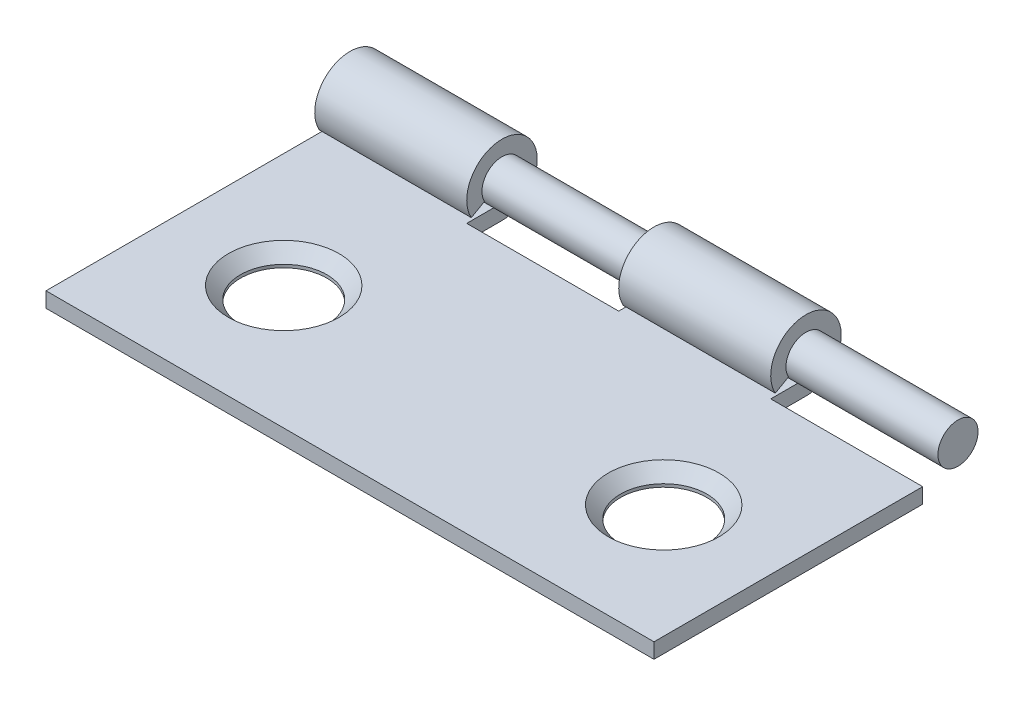
ISO-10303-21;
HEADER;
FILE_DESCRIPTION(('STEP AP214'),'2;1');
FILE_NAME('part.step','',(''),(''),'','','');
FILE_SCHEMA(('AUTOMOTIVE_DESIGN { 1 0 10303 214 1 1 1 1 }'));
ENDSEC;
DATA;
#1=APPLICATION_CONTEXT('core data for automotive mechanical design processes');
#2=APPLICATION_PROTOCOL_DEFINITION('international standard','automotive_design',2000,#1);
#3=PRODUCT_CONTEXT('',#1,'mechanical');
#4=PRODUCT('Part','Part','',(#3));
#5=PRODUCT_RELATED_PRODUCT_CATEGORY('part','',(#4));
#6=PRODUCT_DEFINITION_FORMATION('','',#4);
#7=PRODUCT_DEFINITION_CONTEXT('part definition',#1,'design');
#8=PRODUCT_DEFINITION('design','',#6,#7);
#9=PRODUCT_DEFINITION_SHAPE('','',#8);
#10=(LENGTH_UNIT() NAMED_UNIT(*) SI_UNIT(.MILLI.,.METRE.));
#11=(NAMED_UNIT(*) PLANE_ANGLE_UNIT() SI_UNIT($,.RADIAN.));
#12=(NAMED_UNIT(*) SI_UNIT($,.STERADIAN.) SOLID_ANGLE_UNIT());
#13=UNCERTAINTY_MEASURE_WITH_UNIT(LENGTH_MEASURE(1.E-05),#10,'distance_accuracy_value','');
#14=(GEOMETRIC_REPRESENTATION_CONTEXT(3) GLOBAL_UNCERTAINTY_ASSIGNED_CONTEXT((#13)) GLOBAL_UNIT_ASSIGNED_CONTEXT((#10,
#11,#12)) REPRESENTATION_CONTEXT('',''));
#15=CARTESIAN_POINT('',(0.,0.,0.));
#16=DIRECTION('',(0.,0.,1.));
#17=DIRECTION('',(1.,0.,0.));
#18=AXIS2_PLACEMENT_3D('',#15,#16,#17);
#19=CARTESIAN_POINT('',(12.6999999999999,0.,0.));
#20=DIRECTION('',(-1.,0.,0.));
#21=DIRECTION('',(0.,0.,1.));
#22=AXIS2_PLACEMENT_3D('',#19,#20,#21);
#23=CYLINDRICAL_SURFACE('',#22,0.8382);
#24=CARTESIAN_POINT('',(12.6999999999999,0.,0.));
#25=DIRECTION('',(1.,0.,0.));
#26=DIRECTION('',(0.,0.,-1.));
#27=AXIS2_PLACEMENT_3D('',#24,#25,#26);
#28=CIRCLE('',#27,0.8382);
#29=CARTESIAN_POINT('',(12.6999999999999,0.,0.838199999999958));
#30=VERTEX_POINT('',#29);
#31=EDGE_CURVE('E11',#30,#30,#28,.T.);
#32=CARTESIAN_POINT('',(-12.7000000000002,0.,0.));
#33=DIRECTION('',(1.,0.,0.));
#34=DIRECTION('',(0.,0.,-1.));
#35=AXIS2_PLACEMENT_3D('',#32,#33,#34);
#36=CIRCLE('',#35,0.8382);
#37=CARTESIAN_POINT('',(-12.7000000000002,0.,0.838199999999967));
#38=VERTEX_POINT('',#37);
#39=EDGE_CURVE('E53',#38,#38,#36,.T.);
#40=CARTESIAN_POINT('',(12.6999999999999,0.,0.838199999999958));
#41=CARTESIAN_POINT('',(12.4354166666666,0.,0.838199999999958));
#42=CARTESIAN_POINT('',(12.1708333333332,0.,0.838199999999958));
#43=CARTESIAN_POINT('',(11.6416666666666,0.,0.838199999999959));
#44=CARTESIAN_POINT('',(11.3770833333332,0.,0.838199999999959));
#45=CARTESIAN_POINT('',(10.8479166666666,0.,0.838199999999959));
#46=CARTESIAN_POINT('',(10.5833333333332,0.,0.838199999999959));
#47=CARTESIAN_POINT('',(10.0541666666666,0.,0.838199999999959));
#48=CARTESIAN_POINT('',(9.78958333333323,0.,0.838199999999959));
#49=CARTESIAN_POINT('',(9.26041666666657,0.,0.838199999999959));
#50=CARTESIAN_POINT('',(8.99583333333323,0.,0.83819999999996));
#51=CARTESIAN_POINT('',(8.46666666666657,0.,0.83819999999996));
#52=CARTESIAN_POINT('',(8.20208333333323,0.,0.83819999999996));
#53=CARTESIAN_POINT('',(7.67291666666656,0.,0.83819999999996));
#54=CARTESIAN_POINT('',(7.40833333333323,0.,0.83819999999996));
#55=CARTESIAN_POINT('',(6.87916666666656,0.,0.83819999999996));
#56=CARTESIAN_POINT('',(6.61458333333323,0.,0.83819999999996));
#57=CARTESIAN_POINT('',(6.08541666666656,0.,0.838199999999961));
#58=CARTESIAN_POINT('',(5.82083333333322,0.,0.838199999999961));
#59=CARTESIAN_POINT('',(5.29166666666656,0.,0.838199999999961));
#60=CARTESIAN_POINT('',(5.02708333333322,0.,0.838199999999961));
#61=CARTESIAN_POINT('',(4.49791666666655,0.,0.838199999999961));
#62=CARTESIAN_POINT('',(4.23333333333322,0.,0.838199999999961));
#63=CARTESIAN_POINT('',(3.70416666666655,0.,0.838199999999961));
#64=CARTESIAN_POINT('',(3.43958333333322,0.,0.838199999999961));
#65=CARTESIAN_POINT('',(2.91041666666655,0.,0.838199999999962));
#66=CARTESIAN_POINT('',(2.64583333333322,0.,0.838199999999962));
#67=CARTESIAN_POINT('',(2.11666666666655,0.,0.838199999999962));
#68=CARTESIAN_POINT('',(1.85208333333321,0.,0.838199999999962));
#69=CARTESIAN_POINT('',(1.32291666666655,0.,0.838199999999962));
#70=CARTESIAN_POINT('',(1.05833333333321,0.,0.838199999999962));
#71=CARTESIAN_POINT('',(0.529166666666545,0.,0.838199999999962));
#72=CARTESIAN_POINT('',(0.264583333333211,0.,0.838199999999962));
#73=CARTESIAN_POINT('',(-0.264583333333457,0.,0.838199999999963));
#74=CARTESIAN_POINT('',(-0.529166666666792,0.,0.838199999999963));
#75=CARTESIAN_POINT('',(-1.05833333333346,0.,0.838199999999963));
#76=CARTESIAN_POINT('',(-1.32291666666679,0.,0.838199999999963));
#77=CARTESIAN_POINT('',(-1.85208333333346,0.,0.838199999999963));
#78=CARTESIAN_POINT('',(-2.11666666666679,0.,0.838199999999963));
#79=CARTESIAN_POINT('',(-2.64583333333346,0.,0.838199999999963));
#80=CARTESIAN_POINT('',(-2.9104166666668,0.,0.838199999999963));
#81=CARTESIAN_POINT('',(-3.43958333333346,0.,0.838199999999964));
#82=CARTESIAN_POINT('',(-3.7041666666668,0.,0.838199999999964));
#83=CARTESIAN_POINT('',(-4.23333333333346,0.,0.838199999999964));
#84=CARTESIAN_POINT('',(-4.4979166666668,0.,0.838199999999964));
#85=CARTESIAN_POINT('',(-5.02708333333347,0.,0.838199999999964));
#86=CARTESIAN_POINT('',(-5.2916666666668,0.,0.838199999999964));
#87=CARTESIAN_POINT('',(-5.82083333333347,0.,0.838199999999964));
#88=CARTESIAN_POINT('',(-6.0854166666668,0.,0.838199999999964));
#89=CARTESIAN_POINT('',(-6.61458333333347,0.,0.838199999999965));
#90=CARTESIAN_POINT('',(-6.8791666666668,0.,0.838199999999965));
#91=CARTESIAN_POINT('',(-7.40833333333347,0.,0.838199999999965));
#92=CARTESIAN_POINT('',(-7.67291666666681,0.,0.838199999999965));
#93=CARTESIAN_POINT('',(-8.20208333333348,0.,0.838199999999965));
#94=CARTESIAN_POINT('',(-8.46666666666681,0.,0.838199999999965));
#95=CARTESIAN_POINT('',(-8.99583333333348,0.,0.838199999999965));
#96=CARTESIAN_POINT('',(-9.26041666666681,0.,0.838199999999965));
#97=CARTESIAN_POINT('',(-9.78958333333348,0.,0.838199999999966));
#98=CARTESIAN_POINT('',(-10.0541666666668,0.,0.838199999999966));
#99=CARTESIAN_POINT('',(-10.5833333333335,0.,0.838199999999966));
#100=CARTESIAN_POINT('',(-10.8479166666668,0.,0.838199999999966));
#101=CARTESIAN_POINT('',(-11.3770833333335,0.,0.838199999999966));
#102=CARTESIAN_POINT('',(-11.6416666666668,0.,0.838199999999966));
#103=CARTESIAN_POINT('',(-12.1708333333335,0.,0.838199999999966));
#104=CARTESIAN_POINT('',(-12.4354166666668,0.,0.838199999999966));
#105=CARTESIAN_POINT('',(-12.7000000000002,0.,0.838199999999967));
#106=B_SPLINE_CURVE_WITH_KNOTS('',3,(#40,#41,#42,#43,#44,#45,#46,#47,#48,#49,#50,#51,#52,#53,
#54,#55,#56,#57,#58,#59,#60,#61,#62,#63,#64,#65,#66,#67,#68,#69,#70,#71,#72,#73,#74,#75,#76,#77,
#78,#79,#80,#81,#82,#83,#84,#85,#86,#87,#88,#89,#90,#91,#92,#93,#94,#95,#96,#97,#98,#99,#100,
#101,#102,#103,#104,#105),.UNSPECIFIED.,.F.,.F.,(4,2,2,2,2,2,2,2,2,2,2,2,2,2,2,2,2,2,2,2,2,2,2,
2,2,2,2,2,2,2,2,2,4),(0.,0.793750000000001,1.5875,2.38125,3.17500000000001,3.96875000000001,
4.76250000000001,5.55625000000001,6.35000000000001,7.14375000000002,7.93750000000002,
8.73125000000002,9.52500000000002,10.31875,11.1125,11.90625,12.7,13.49375,14.2875,15.08125,
15.875,16.66875,17.4625,18.25625,19.05,19.84375,20.6375,21.43125,22.2250000000001,
23.0187500000001,23.8125000000001,24.6062500000001,25.4000000000001),.UNSPECIFIED.);
#107=EDGE_CURVE('BSEAM50',#30,#38,#106,.T.);
#108=ORIENTED_EDGE('',*,*,#31,.F.);
#109=ORIENTED_EDGE('',*,*,#39,.T.);
#110=ORIENTED_EDGE('',*,*,#107,.T.);
#111=ORIENTED_EDGE('',*,*,#107,.F.);
#112=EDGE_LOOP('',(#108,#110,#109,#111));
#113=FACE_BOUND('',#112,.T.);
#114=ADVANCED_FACE('F50',(#113),#23,.T.);
#115=CARTESIAN_POINT('',(12.6999999999999,0.,0.));
#116=DIRECTION('',(1.,0.,0.));
#117=DIRECTION('',(0.,0.,-1.));
#118=AXIS2_PLACEMENT_3D('',#115,#116,#117);
#119=PLANE('',#118);
#120=ORIENTED_EDGE('',*,*,#31,.T.);
#121=EDGE_LOOP('',(#120));
#122=FACE_BOUND('',#121,.T.);
#123=ADVANCED_FACE('F65',(#122),#119,.T.);
#124=CARTESIAN_POINT('',(-12.7000000000002,0.,0.));
#125=DIRECTION('',(1.,0.,0.));
#126=DIRECTION('',(0.,0.,-1.));
#127=AXIS2_PLACEMENT_3D('',#124,#125,#126);
#128=PLANE('',#127);
#129=ORIENTED_EDGE('',*,*,#39,.F.);
#130=EDGE_LOOP('',(#129));
#131=FACE_BOUND('',#130,.T.);
#132=ADVANCED_FACE('F63',(#131),#128,.F.);
#133=CLOSED_SHELL('',(#114,#123,#132));
#134=MANIFOLD_SOLID_BREP('B2',#133);
#135=CARTESIAN_POINT('',(12.6999999999999,1.38777878078145E-13,0.));
#136=DIRECTION('',(-1.,0.,0.));
#137=DIRECTION('',(0.,0.,1.));
#138=AXIS2_PLACEMENT_3D('',#135,#136,#137);
#139=CYLINDRICAL_SURFACE('',#138,1.47320000000008);
#140=CARTESIAN_POINT('',(6.3499999999999,2.22044604925031E-13,0.));
#141=DIRECTION('',(-1.,0.,0.));
#142=DIRECTION('',(0.,0.,1.));
#143=AXIS2_PLACEMENT_3D('',#140,#141,#142);
#144=CIRCLE('',#143,1.47320000000008);
#145=CARTESIAN_POINT('',(6.34999999999991,-0.728533124002562,1.28045215733776));
#146=VERTEX_POINT('',#145);
#147=CARTESIAN_POINT('',(6.34999999999987,-1.47320000000001,0.));
#148=VERTEX_POINT('',#147);
#149=EDGE_CURVE('E241',#146,#148,#144,.T.);
#150=ORIENTED_EDGE('',*,*,#149,.T.);
#151=DIRECTION('',(-1.,0.,0.));
#152=VECTOR('',#151,1.);
#153=CARTESIAN_POINT('',(12.6999999999999,-1.47320000000001,0.));
#154=LINE('',#153,#152);
#155=CARTESIAN_POINT('',(0.,-1.47319999999998,0.));
#156=VERTEX_POINT('',#155);
#157=EDGE_CURVE('E224',#148,#156,#154,.T.);
#158=ORIENTED_EDGE('',*,*,#157,.T.);
#159=CARTESIAN_POINT('',(0.,0.,0.));
#160=DIRECTION('',(1.,0.,0.));
#161=DIRECTION('',(0.,0.,-1.));
#162=AXIS2_PLACEMENT_3D('',#159,#160,#161);
#163=CIRCLE('',#162,1.47320000000008);
#164=CARTESIAN_POINT('',(-1.38777878078145E-13,-0.728533124002534,1.2804521573378));
#165=VERTEX_POINT('',#164);
#166=EDGE_CURVE('E265',#156,#165,#163,.T.);
#167=ORIENTED_EDGE('',*,*,#166,.T.);
#168=DIRECTION('',(-1.,0.,0.));
#169=VECTOR('',#168,1.);
#170=CARTESIAN_POINT('',(12.6999999999999,-0.728533124002562,1.28045215733778));
#171=LINE('',#170,#169);
#172=EDGE_CURVE('E302',#146,#165,#171,.T.);
#173=ORIENTED_EDGE('',*,*,#172,.F.);
#174=EDGE_LOOP('',(#150,#158,#167,#173));
#175=FACE_BOUND('',#174,.T.);
#176=ADVANCED_FACE('F102',(#175),#139,.T.);
#177=CARTESIAN_POINT('',(12.6999999999999,0.,0.));
#178=DIRECTION('',(-1.,0.,0.));
#179=DIRECTION('',(0.,0.,1.));
#180=AXIS2_PLACEMENT_3D('',#177,#178,#179);
#181=CYLINDRICAL_SURFACE('',#180,0.8382);
#182=DIRECTION('',(-1.,0.,0.));
#183=VECTOR('',#182,1.);
#184=CARTESIAN_POINT('',(12.6999999999999,-0.838199999999956,0.));
#185=LINE('',#184,#183);
#186=CARTESIAN_POINT('',(6.34999999999988,-0.838200000000039,0.));
#187=VERTEX_POINT('',#186);
#188=CARTESIAN_POINT('',(-1.11022302462516E-13,-0.838199999999872,0.));
#189=VERTEX_POINT('',#188);
#190=EDGE_CURVE('E313',#187,#189,#185,.T.);
#191=ORIENTED_EDGE('',*,*,#190,.F.);
#192=CARTESIAN_POINT('',(6.3499999999999,1.38777878078145E-13,0.));
#193=DIRECTION('',(-1.,0.,0.));
#194=DIRECTION('',(0.,0.,1.));
#195=AXIS2_PLACEMENT_3D('',#192,#193,#194);
#196=CIRCLE('',#195,0.8382);
#197=CARTESIAN_POINT('',(6.34999999999987,-0.414510225725695,0.728533124002506));
#198=VERTEX_POINT('',#197);
#199=EDGE_CURVE('E235',#187,#198,#196,.F.);
#200=ORIENTED_EDGE('',*,*,#199,.T.);
#201=DIRECTION('',(-1.,0.,0.));
#202=VECTOR('',#201,1.);
#203=CARTESIAN_POINT('',(12.6999999999999,-0.414510225725556,0.72853312400252));
#204=LINE('',#203,#202);
#205=CARTESIAN_POINT('',(-1.38777878078145E-13,-0.414510225725528,0.728533124002527));
#206=VERTEX_POINT('',#205);
#207=EDGE_CURVE('E299',#198,#206,#204,.T.);
#208=ORIENTED_EDGE('',*,*,#207,.T.);
#209=CARTESIAN_POINT('',(0.,0.,0.));
#210=DIRECTION('',(1.,0.,0.));
#211=DIRECTION('',(0.,0.,-1.));
#212=AXIS2_PLACEMENT_3D('',#209,#210,#211);
#213=CIRCLE('',#212,0.8382);
#214=EDGE_CURVE('E264',#206,#189,#213,.F.);
#215=ORIENTED_EDGE('',*,*,#214,.T.);
#216=EDGE_LOOP('',(#191,#200,#208,#215));
#217=FACE_BOUND('',#216,.T.);
#218=ADVANCED_FACE('F388',(#217),#181,.F.);
#219=CARTESIAN_POINT('',(12.6999999999999,-0.414510225725556,0.72853312400252));
#220=DIRECTION('',(0.,0.869163832024046,0.494524249255059));
#221=DIRECTION('',(0.,-0.494524249255061,0.869163832024044));
#222=AXIS2_PLACEMENT_3D('',#219,#220,#221);
#223=PLANE('',#222);
#224=ORIENTED_EDGE('',*,*,#207,.F.);
#225=DIRECTION('',(0.,-0.494524249255061,0.869163832024044));
#226=VECTOR('',#225,1.);
#227=CARTESIAN_POINT('',(6.34999999999987,-0.414510225725695,0.728533124002506));
#228=LINE('',#227,#226);
#229=EDGE_CURVE('E238',#198,#146,#228,.T.);
#230=ORIENTED_EDGE('',*,*,#229,.T.);
#231=ORIENTED_EDGE('',*,*,#172,.T.);
#232=DIRECTION('',(0.,0.494524249255061,-0.869163832024044));
#233=VECTOR('',#232,1.);
#234=CARTESIAN_POINT('',(-1.38777878078145E-13,-0.414510225725528,0.728533124002527));
#235=LINE('',#234,#233);
#236=EDGE_CURVE('E48',#165,#206,#235,.T.);
#237=ORIENTED_EDGE('',*,*,#236,.T.);
#238=EDGE_LOOP('',(#224,#230,#231,#237));
#239=FACE_BOUND('',#238,.T.);
#240=ADVANCED_FACE('F385',(#239),#223,.F.);
#241=CARTESIAN_POINT('',(-6.35000000000011,-0.838200000000011,0.));
#242=VERTEX_POINT('',#241);
#243=CARTESIAN_POINT('',(-12.7,-0.838200000000011,0.));
#244=VERTEX_POINT('',#243);
#245=EDGE_CURVE('E312',#242,#244,#185,.T.);
#246=ORIENTED_EDGE('',*,*,#245,.F.);
#247=CARTESIAN_POINT('',(-6.35000000000013,1.11022302462516E-13,0.));
#248=DIRECTION('',(-1.,0.,0.));
#249=DIRECTION('',(0.,0.,1.));
#250=AXIS2_PLACEMENT_3D('',#247,#248,#249);
#251=CIRCLE('',#250,0.8382);
#252=CARTESIAN_POINT('',(-6.35000000000016,-0.414510225725473,0.728533124002485));
#253=VERTEX_POINT('',#252);
#254=EDGE_CURVE('E255',#242,#253,#251,.F.);
#255=ORIENTED_EDGE('',*,*,#254,.T.);
#256=CARTESIAN_POINT('',(-12.7000000000001,-0.414510225725528,0.728533124002534));
#257=VERTEX_POINT('',#256);
#258=EDGE_CURVE('E284',#253,#257,#204,.T.);
#259=ORIENTED_EDGE('',*,*,#258,.T.);
#260=CARTESIAN_POINT('',(-12.7000000000002,0.,0.));
#261=DIRECTION('',(-1.,0.,0.));
#262=DIRECTION('',(0.,0.,1.));
#263=AXIS2_PLACEMENT_3D('',#260,#261,#262);
#264=CIRCLE('',#263,0.8382);
#265=EDGE_CURVE('E276',#257,#244,#264,.T.);
#266=ORIENTED_EDGE('',*,*,#265,.T.);
#267=EDGE_LOOP('',(#246,#255,#259,#266));
#268=FACE_BOUND('',#267,.T.);
#269=ADVANCED_FACE('F104',(#268),#181,.F.);
#270=CARTESIAN_POINT('',(12.6999999999999,-0.838199999999983,12.7));
#271=DIRECTION('',(0.,-1.,0.));
#272=DIRECTION('',(0.,0.,-1.));
#273=AXIS2_PLACEMENT_3D('',#270,#271,#272);
#274=PLANE('',#273);
#275=CARTESIAN_POINT('',(7.95019999999984,-0.838200000000011,7.54379999999995));
#276=DIRECTION('',(0.,1.,0.));
#277=DIRECTION('',(0.,0.,1.));
#278=AXIS2_PLACEMENT_3D('',#275,#276,#277);
#279=CIRCLE('',#278,2.3114);
#280=CARTESIAN_POINT('',(7.95019999999984,-0.838200000000011,9.85519999999996));
#281=VERTEX_POINT('',#280);
#282=EDGE_CURVE('E225',#281,#281,#279,.T.);
#283=ORIENTED_EDGE('',*,*,#282,.F.);
#284=EDGE_LOOP('',(#283));
#285=FACE_BOUND('',#284,.T.);
#286=CARTESIAN_POINT('',(-7.92480000000015,-0.838200000000039,7.54379999999998));
#287=DIRECTION('',(0.,1.,0.));
#288=DIRECTION('',(0.,0.,1.));
#289=AXIS2_PLACEMENT_3D('',#286,#287,#288);
#290=CIRCLE('',#289,2.3114);
#291=CARTESIAN_POINT('',(-7.92480000000015,-0.838200000000039,9.85519999999998));
#292=VERTEX_POINT('',#291);
#293=EDGE_CURVE('E228',#292,#292,#290,.T.);
#294=ORIENTED_EDGE('',*,*,#293,.F.);
#295=EDGE_LOOP('',(#294));
#296=FACE_BOUND('',#295,.T.);
#297=DIRECTION('',(0.,0.,1.));
#298=VECTOR('',#297,1.);
#299=CARTESIAN_POINT('',(12.6999999999999,-0.838199999999983,12.7));
#300=LINE('',#299,#298);
#301=CARTESIAN_POINT('',(12.6999999999999,-0.838200000000011,1.47320000000012));
#302=VERTEX_POINT('',#301);
#303=CARTESIAN_POINT('',(12.6999999999999,-0.838199999999983,12.7));
#304=VERTEX_POINT('',#303);
#305=EDGE_CURVE('E277',#302,#304,#300,.T.);
#306=ORIENTED_EDGE('',*,*,#305,.F.);
#307=DIRECTION('',(-1.,0.,0.));
#308=VECTOR('',#307,1.);
#309=CARTESIAN_POINT('',(12.6999999999999,-0.838200000000011,1.47320000000012));
#310=LINE('',#309,#308);
#311=CARTESIAN_POINT('',(6.34999999999988,-0.8381999999999,1.47320000000006));
#312=VERTEX_POINT('',#311);
#313=EDGE_CURVE('E119',#302,#312,#310,.T.);
#314=ORIENTED_EDGE('',*,*,#313,.T.);
#315=DIRECTION('',(0.,0.,-1.));
#316=VECTOR('',#315,1.);
#317=CARTESIAN_POINT('',(6.34999999999988,-0.838199999999983,12.7));
#318=LINE('',#317,#316);
#319=EDGE_CURVE('E212',#312,#187,#318,.T.);
#320=ORIENTED_EDGE('',*,*,#319,.T.);
#321=ORIENTED_EDGE('',*,*,#190,.T.);
#322=DIRECTION('',(0.,0.,1.));
#323=VECTOR('',#322,1.);
#324=CARTESIAN_POINT('',(-1.38777878078145E-13,-0.838199999999983,12.6999999999999));
#325=LINE('',#324,#323);
#326=CARTESIAN_POINT('',(-1.38777878078145E-13,-0.838200000000011,1.47320000000007));
#327=VERTEX_POINT('',#326);
#328=EDGE_CURVE('E268',#189,#327,#325,.T.);
#329=ORIENTED_EDGE('',*,*,#328,.T.);
#330=DIRECTION('',(-1.,0.,0.));
#331=VECTOR('',#330,1.);
#332=CARTESIAN_POINT('',(12.6999999999999,-0.838200000000011,1.47320000000012));
#333=LINE('',#332,#331);
#334=CARTESIAN_POINT('',(-6.35000000000013,-0.838199999999983,1.47320000000008));
#335=VERTEX_POINT('',#334);
#336=EDGE_CURVE('E273',#327,#335,#333,.T.);
#337=ORIENTED_EDGE('',*,*,#336,.T.);
#338=DIRECTION('',(0.,0.,-1.));
#339=VECTOR('',#338,1.);
#340=CARTESIAN_POINT('',(-6.35000000000013,-0.838199999999983,12.7));
#341=LINE('',#340,#339);
#342=EDGE_CURVE('E259',#335,#242,#341,.T.);
#343=ORIENTED_EDGE('',*,*,#342,.T.);
#344=ORIENTED_EDGE('',*,*,#245,.T.);
#345=DIRECTION('',(0.,0.,1.));
#346=VECTOR('',#345,1.);
#347=CARTESIAN_POINT('',(-12.7000000000001,-0.838199999999956,12.7));
#348=LINE('',#347,#346);
#349=CARTESIAN_POINT('',(-12.7000000000001,-0.838199999999956,12.7));
#350=VERTEX_POINT('',#349);
#351=EDGE_CURVE('E287',#244,#350,#348,.T.);
#352=ORIENTED_EDGE('',*,*,#351,.T.);
#353=DIRECTION('',(-1.,0.,0.));
#354=VECTOR('',#353,1.);
#355=CARTESIAN_POINT('',(12.6999999999999,-0.838199999999983,12.7));
#356=LINE('',#355,#354);
#357=EDGE_CURVE('E309',#304,#350,#356,.T.);
#358=ORIENTED_EDGE('',*,*,#357,.F.);
#359=EDGE_LOOP('',(#306,#314,#320,#321,#329,#337,#343,#344,#352,#358));
#360=FACE_BOUND('',#359,.T.);
#361=ADVANCED_FACE('F346',(#285,#296,#360),#274,.F.);
#362=CARTESIAN_POINT('',(12.6999999999999,-1.4731999999999,12.6999999999999));
#363=DIRECTION('',(0.,0.,-1.));
#364=DIRECTION('',(-1.,0.,0.));
#365=AXIS2_PLACEMENT_3D('',#362,#363,#364);
#366=PLANE('',#365);
#367=DIRECTION('',(0.,-1.,0.));
#368=VECTOR('',#367,1.);
#369=CARTESIAN_POINT('',(-12.7000000000002,-1.47320000000001,12.6999999999999));
#370=LINE('',#369,#368);
#371=CARTESIAN_POINT('',(-12.7000000000002,-1.47320000000001,12.6999999999999));
#372=VERTEX_POINT('',#371);
#373=EDGE_CURVE('E289',#350,#372,#370,.T.);
#374=ORIENTED_EDGE('',*,*,#373,.T.);
#375=DIRECTION('',(-1.,0.,0.));
#376=VECTOR('',#375,1.);
#377=CARTESIAN_POINT('',(12.6999999999999,-1.4731999999999,12.6999999999999));
#378=LINE('',#377,#376);
#379=CARTESIAN_POINT('',(12.6999999999999,-1.4731999999999,12.6999999999999));
#380=VERTEX_POINT('',#379);
#381=EDGE_CURVE('E306',#380,#372,#378,.T.);
#382=ORIENTED_EDGE('',*,*,#381,.F.);
#383=DIRECTION('',(0.,-1.,0.));
#384=VECTOR('',#383,1.);
#385=CARTESIAN_POINT('',(12.6999999999999,-1.4731999999999,12.6999999999999));
#386=LINE('',#385,#384);
#387=EDGE_CURVE('E279',#304,#380,#386,.T.);
#388=ORIENTED_EDGE('',*,*,#387,.F.);
#389=ORIENTED_EDGE('',*,*,#357,.T.);
#390=EDGE_LOOP('',(#374,#382,#388,#389));
#391=FACE_BOUND('',#390,.T.);
#392=ADVANCED_FACE('F349',(#391),#366,.F.);
#393=CARTESIAN_POINT('',(12.6999999999999,-1.47320000000001,0.));
#394=DIRECTION('',(0.,1.,0.));
#395=DIRECTION('',(0.,0.,1.));
#396=AXIS2_PLACEMENT_3D('',#393,#394,#395);
#397=PLANE('',#396);
#398=CARTESIAN_POINT('',(7.95019999999992,-1.47319999999998,7.54379999999995));
#399=DIRECTION('',(0.,1.,0.));
#400=DIRECTION('',(0.,0.,1.));
#401=AXIS2_PLACEMENT_3D('',#398,#399,#400);
#402=CIRCLE('',#401,1.8034);
#403=CARTESIAN_POINT('',(7.95019999999992,-1.47319999999998,9.34719999999995));
#404=VERTEX_POINT('',#403);
#405=EDGE_CURVE('E317',#404,#404,#402,.T.);
#406=ORIENTED_EDGE('',*,*,#405,.T.);
#407=EDGE_LOOP('',(#406));
#408=FACE_BOUND('',#407,.T.);
#409=CARTESIAN_POINT('',(-7.92480000000012,-1.47320000000001,7.54379999999996));
#410=DIRECTION('',(0.,1.,0.));
#411=DIRECTION('',(0.,0.,1.));
#412=AXIS2_PLACEMENT_3D('',#409,#410,#411);
#413=CIRCLE('',#412,1.8034);
#414=CARTESIAN_POINT('',(-7.92480000000012,-1.47320000000001,9.34719999999996));
#415=VERTEX_POINT('',#414);
#416=EDGE_CURVE('E322',#415,#415,#413,.T.);
#417=ORIENTED_EDGE('',*,*,#416,.T.);
#418=EDGE_LOOP('',(#417));
#419=FACE_BOUND('',#418,.T.);
#420=DIRECTION('',(0.,0.,1.));
#421=VECTOR('',#420,1.);
#422=CARTESIAN_POINT('',(6.34999999999987,-1.47320000000001,1.4732000000001));
#423=LINE('',#422,#421);
#424=CARTESIAN_POINT('',(6.34999999999987,-1.47320000000001,1.4732000000001));
#425=VERTEX_POINT('',#424);
#426=EDGE_CURVE('E209',#148,#425,#423,.T.);
#427=ORIENTED_EDGE('',*,*,#426,.T.);
#428=DIRECTION('',(1.,0.,0.));
#429=VECTOR('',#428,1.);
#430=CARTESIAN_POINT('',(12.6999999999999,-1.47319999999998,1.47320000000009));
#431=LINE('',#430,#429);
#432=CARTESIAN_POINT('',(12.6999999999999,-1.47319999999998,1.47320000000009));
#433=VERTEX_POINT('',#432);
#434=EDGE_CURVE('E214',#425,#433,#431,.T.);
#435=ORIENTED_EDGE('',*,*,#434,.T.);
#436=DIRECTION('',(0.,0.,-1.));
#437=VECTOR('',#436,1.);
#438=CARTESIAN_POINT('',(12.6999999999999,-1.47320000000001,0.));
#439=LINE('',#438,#437);
#440=EDGE_CURVE('E282',#380,#433,#439,.T.);
#441=ORIENTED_EDGE('',*,*,#440,.F.);
#442=ORIENTED_EDGE('',*,*,#381,.T.);
#443=DIRECTION('',(0.,0.,-1.));
#444=VECTOR('',#443,1.);
#445=CARTESIAN_POINT('',(-12.7000000000001,-1.47319999999998,0.));
#446=LINE('',#445,#444);
#447=CARTESIAN_POINT('',(-12.7000000000001,-1.47319999999998,0.));
#448=VERTEX_POINT('',#447);
#449=EDGE_CURVE('E291',#372,#448,#446,.T.);
#450=ORIENTED_EDGE('',*,*,#449,.T.);
#451=CARTESIAN_POINT('',(-6.35000000000013,-1.47319999999998,-1.11022302462516E-13));
#452=VERTEX_POINT('',#451);
#453=EDGE_CURVE('E304',#452,#448,#154,.T.);
#454=ORIENTED_EDGE('',*,*,#453,.F.);
#455=DIRECTION('',(0.,0.,1.));
#456=VECTOR('',#455,1.);
#457=CARTESIAN_POINT('',(-6.35000000000013,-1.47320000000009,1.4732000000001));
#458=LINE('',#457,#456);
#459=CARTESIAN_POINT('',(-6.35000000000013,-1.47320000000009,1.4732000000001));
#460=VERTEX_POINT('',#459);
#461=EDGE_CURVE('E245',#452,#460,#458,.T.);
#462=ORIENTED_EDGE('',*,*,#461,.T.);
#463=DIRECTION('',(1.,0.,0.));
#464=VECTOR('',#463,1.);
#465=CARTESIAN_POINT('',(-1.66533453693773E-13,-1.47319999999998,1.4732000000001));
#466=LINE('',#465,#464);
#467=CARTESIAN_POINT('',(-1.66533453693773E-13,-1.47319999999998,1.4732000000001));
#468=VERTEX_POINT('',#467);
#469=EDGE_CURVE('E248',#460,#468,#466,.T.);
#470=ORIENTED_EDGE('',*,*,#469,.T.);
#471=DIRECTION('',(0.,0.,-1.));
#472=VECTOR('',#471,1.);
#473=CARTESIAN_POINT('',(-1.38777878078145E-13,-1.47320000000001,-1.47320000000017));
#474=LINE('',#473,#472);
#475=EDGE_CURVE('E243',#468,#156,#474,.T.);
#476=ORIENTED_EDGE('',*,*,#475,.T.);
#477=ORIENTED_EDGE('',*,*,#157,.F.);
#478=EDGE_LOOP('',(#427,#435,#441,#442,#450,#454,#462,#470,#476,#477));
#479=FACE_BOUND('',#478,.T.);
#480=ADVANCED_FACE('F222',(#408,#419,#479),#397,.F.);
#481=CARTESIAN_POINT('',(-6.35000000000011,-0.728533124002534,1.28045215733778));
#482=VERTEX_POINT('',#481);
#483=CARTESIAN_POINT('',(-12.7000000000001,-0.728533124002534,1.28045215733778));
#484=VERTEX_POINT('',#483);
#485=EDGE_CURVE('E301',#482,#484,#171,.T.);
#486=ORIENTED_EDGE('',*,*,#485,.F.);
#487=CARTESIAN_POINT('',(-6.35000000000013,1.66533453693773E-13,-1.04083408558608E-13));
#488=DIRECTION('',(-1.,0.,0.));
#489=DIRECTION('',(0.,0.,1.));
#490=AXIS2_PLACEMENT_3D('',#487,#488,#489);
#491=CIRCLE('',#490,1.47320000000008);
#492=EDGE_CURVE('E127',#482,#452,#491,.T.);
#493=ORIENTED_EDGE('',*,*,#492,.T.);
#494=ORIENTED_EDGE('',*,*,#453,.T.);
#495=CARTESIAN_POINT('',(-12.7000000000001,0.,-1.04083408558608E-13));
#496=DIRECTION('',(1.,0.,0.));
#497=DIRECTION('',(0.,0.,1.));
#498=AXIS2_PLACEMENT_3D('',#495,#496,#497);
#499=CIRCLE('',#498,1.47320000000008);
#500=EDGE_CURVE('E294',#448,#484,#499,.T.);
#501=ORIENTED_EDGE('',*,*,#500,.T.);
#502=EDGE_LOOP('',(#486,#493,#494,#501));
#503=FACE_BOUND('',#502,.T.);
#504=ADVANCED_FACE('F369',(#503),#139,.T.);
#505=ORIENTED_EDGE('',*,*,#258,.F.);
#506=DIRECTION('',(0.,-0.494524249255061,0.869163832024044));
#507=VECTOR('',#506,1.);
#508=CARTESIAN_POINT('',(-6.35000000000016,-0.414510225725501,0.728533124002485));
#509=LINE('',#508,#507);
#510=EDGE_CURVE('E111',#253,#482,#509,.T.);
#511=ORIENTED_EDGE('',*,*,#510,.T.);
#512=ORIENTED_EDGE('',*,*,#485,.T.);
#513=DIRECTION('',(0.,0.494524249255061,-0.869163832024044));
#514=VECTOR('',#513,1.);
#515=CARTESIAN_POINT('',(-12.7000000000001,-0.414510225725528,0.728533124002534));
#516=LINE('',#515,#514);
#517=EDGE_CURVE('E280',#484,#257,#516,.T.);
#518=ORIENTED_EDGE('',*,*,#517,.T.);
#519=EDGE_LOOP('',(#505,#511,#512,#518));
#520=FACE_BOUND('',#519,.T.);
#521=ADVANCED_FACE('F405',(#520),#223,.F.);
#522=CARTESIAN_POINT('',(12.6999999999999,0.,0.));
#523=DIRECTION('',(-1.,0.,0.));
#524=DIRECTION('',(0.,0.,1.));
#525=AXIS2_PLACEMENT_3D('',#522,#523,#524);
#526=PLANE('',#525);
#527=ORIENTED_EDGE('',*,*,#440,.T.);
#528=DIRECTION('',(0.,1.,0.));
#529=VECTOR('',#528,1.);
#530=CARTESIAN_POINT('',(12.6999999999999,-1.47319999999998,1.47320000000009));
#531=LINE('',#530,#529);
#532=EDGE_CURVE('E213',#433,#302,#531,.T.);
#533=ORIENTED_EDGE('',*,*,#532,.T.);
#534=ORIENTED_EDGE('',*,*,#305,.T.);
#535=ORIENTED_EDGE('',*,*,#387,.T.);
#536=EDGE_LOOP('',(#527,#533,#534,#535));
#537=FACE_BOUND('',#536,.T.);
#538=ADVANCED_FACE('F355',(#537),#526,.F.);
#539=CARTESIAN_POINT('',(-12.7000000000002,0.,0.));
#540=DIRECTION('',(-1.,0.,0.));
#541=DIRECTION('',(0.,0.,1.));
#542=AXIS2_PLACEMENT_3D('',#539,#540,#541);
#543=PLANE('',#542);
#544=ORIENTED_EDGE('',*,*,#265,.F.);
#545=ORIENTED_EDGE('',*,*,#517,.F.);
#546=ORIENTED_EDGE('',*,*,#500,.F.);
#547=ORIENTED_EDGE('',*,*,#449,.F.);
#548=ORIENTED_EDGE('',*,*,#373,.F.);
#549=ORIENTED_EDGE('',*,*,#351,.F.);
#550=EDGE_LOOP('',(#544,#545,#546,#547,#548,#549));
#551=FACE_BOUND('',#550,.T.);
#552=ADVANCED_FACE('F364',(#551),#543,.T.);
#553=CARTESIAN_POINT('',(-1.66533453693773E-13,-1.47319999999998,1.4732000000001));
#554=DIRECTION('',(0.,0.,1.));
#555=DIRECTION('',(1.,0.,0.));
#556=AXIS2_PLACEMENT_3D('',#553,#554,#555);
#557=PLANE('',#556);
#558=DIRECTION('',(0.,1.,0.));
#559=VECTOR('',#558,1.);
#560=CARTESIAN_POINT('',(-1.66533453693773E-13,-1.47319999999998,1.4732000000001));
#561=LINE('',#560,#559);
#562=EDGE_CURVE('E252',#468,#327,#561,.T.);
#563=ORIENTED_EDGE('',*,*,#562,.F.);
#564=ORIENTED_EDGE('',*,*,#469,.F.);
#565=DIRECTION('',(0.,1.,0.));
#566=VECTOR('',#565,1.);
#567=CARTESIAN_POINT('',(-6.35000000000013,-1.47320000000009,1.4732000000001));
#568=LINE('',#567,#566);
#569=EDGE_CURVE('E251',#460,#335,#568,.T.);
#570=ORIENTED_EDGE('',*,*,#569,.T.);
#571=ORIENTED_EDGE('',*,*,#336,.F.);
#572=EDGE_LOOP('',(#563,#564,#570,#571));
#573=FACE_BOUND('',#572,.T.);
#574=ADVANCED_FACE('F373',(#573),#557,.F.);
#575=CARTESIAN_POINT('',(-1.38777878078145E-13,-1.47320000000001,-1.47320000000017));
#576=DIRECTION('',(1.,0.,0.));
#577=DIRECTION('',(0.,0.,-1.));
#578=AXIS2_PLACEMENT_3D('',#575,#576,#577);
#579=PLANE('',#578);
#580=ORIENTED_EDGE('',*,*,#214,.F.);
#581=ORIENTED_EDGE('',*,*,#236,.F.);
#582=ORIENTED_EDGE('',*,*,#166,.F.);
#583=ORIENTED_EDGE('',*,*,#475,.F.);
#584=ORIENTED_EDGE('',*,*,#562,.T.);
#585=ORIENTED_EDGE('',*,*,#328,.F.);
#586=EDGE_LOOP('',(#580,#581,#582,#583,#584,#585));
#587=FACE_BOUND('',#586,.T.);
#588=ADVANCED_FACE('F379',(#587),#579,.F.);
#589=CARTESIAN_POINT('',(-6.35000000000013,-1.47320000000009,1.4732000000001));
#590=DIRECTION('',(-1.,0.,0.));
#591=DIRECTION('',(0.,0.,1.));
#592=AXIS2_PLACEMENT_3D('',#589,#590,#591);
#593=PLANE('',#592);
#594=ORIENTED_EDGE('',*,*,#492,.F.);
#595=ORIENTED_EDGE('',*,*,#510,.F.);
#596=ORIENTED_EDGE('',*,*,#254,.F.);
#597=ORIENTED_EDGE('',*,*,#342,.F.);
#598=ORIENTED_EDGE('',*,*,#569,.F.);
#599=ORIENTED_EDGE('',*,*,#461,.F.);
#600=EDGE_LOOP('',(#594,#595,#596,#597,#598,#599));
#601=FACE_BOUND('',#600,.T.);
#602=ADVANCED_FACE('F371',(#601),#593,.F.);
#603=CARTESIAN_POINT('',(6.34999999999987,-1.47320000000001,1.4732000000001));
#604=DIRECTION('',(-1.,0.,0.));
#605=DIRECTION('',(0.,0.,1.));
#606=AXIS2_PLACEMENT_3D('',#603,#604,#605);
#607=PLANE('',#606);
#608=ORIENTED_EDGE('',*,*,#149,.F.);
#609=ORIENTED_EDGE('',*,*,#229,.F.);
#610=ORIENTED_EDGE('',*,*,#199,.F.);
#611=ORIENTED_EDGE('',*,*,#319,.F.);
#612=DIRECTION('',(0.,1.,0.));
#613=VECTOR('',#612,1.);
#614=CARTESIAN_POINT('',(6.34999999999987,-1.47320000000001,1.4732000000001));
#615=LINE('',#614,#613);
#616=EDGE_CURVE('E205',#425,#312,#615,.T.);
#617=ORIENTED_EDGE('',*,*,#616,.F.);
#618=ORIENTED_EDGE('',*,*,#426,.F.);
#619=EDGE_LOOP('',(#608,#609,#610,#611,#617,#618));
#620=FACE_BOUND('',#619,.T.);
#621=ADVANCED_FACE('F207',(#620),#607,.F.);
#622=CARTESIAN_POINT('',(12.6999999999999,-1.47319999999998,1.47320000000009));
#623=DIRECTION('',(0.,0.,1.));
#624=DIRECTION('',(1.,0.,0.));
#625=AXIS2_PLACEMENT_3D('',#622,#623,#624);
#626=PLANE('',#625);
#627=ORIENTED_EDGE('',*,*,#532,.F.);
#628=ORIENTED_EDGE('',*,*,#434,.F.);
#629=ORIENTED_EDGE('',*,*,#616,.T.);
#630=ORIENTED_EDGE('',*,*,#313,.F.);
#631=EDGE_LOOP('',(#627,#628,#629,#630));
#632=FACE_BOUND('',#631,.T.);
#633=ADVANCED_FACE('F217',(#632),#626,.F.);
#634=CARTESIAN_POINT('',(-7.92480000000015,-0.838200000000039,7.54379999999998));
#635=DIRECTION('',(0.,1.,0.));
#636=DIRECTION('',(0.,0.,1.));
#637=AXIS2_PLACEMENT_3D('',#634,#635,#636);
#638=CONICAL_SURFACE('',#637,2.3114,0.78539816339745);
#639=CARTESIAN_POINT('',(-7.92480000000015,-1.34619999999999,7.54379999999997));
#640=DIRECTION('',(0.,1.,0.));
#641=DIRECTION('',(0.,0.,1.));
#642=AXIS2_PLACEMENT_3D('',#639,#640,#641);
#643=CIRCLE('',#642,1.8034);
#644=CARTESIAN_POINT('',(-7.92480000000015,-1.34619999999999,9.34719999999997));
#645=VERTEX_POINT('',#644);
#646=EDGE_CURVE('E106',#645,#645,#643,.F.);
#647=ORIENTED_EDGE('',*,*,#646,.T.);
#648=EDGE_LOOP('',(#647));
#649=FACE_BOUND('',#648,.T.);
#650=ORIENTED_EDGE('',*,*,#293,.T.);
#651=EDGE_LOOP('',(#650));
#652=FACE_BOUND('',#651,.T.);
#653=ADVANCED_FACE('F338',(#649,#652),#638,.F.);
#654=CARTESIAN_POINT('',(7.95019999999984,-0.838200000000011,7.54379999999995));
#655=DIRECTION('',(0.,1.,0.));
#656=DIRECTION('',(0.,0.,1.));
#657=AXIS2_PLACEMENT_3D('',#654,#655,#656);
#658=CONICAL_SURFACE('',#657,2.3114,0.78539816339745);
#659=CARTESIAN_POINT('',(7.95019999999991,-1.34619999999988,7.54379999999996));
#660=DIRECTION('',(0.,1.,0.));
#661=DIRECTION('',(0.,0.,1.));
#662=AXIS2_PLACEMENT_3D('',#659,#660,#661);
#663=CIRCLE('',#662,1.8034);
#664=CARTESIAN_POINT('',(7.95019999999991,-1.34619999999988,9.34719999999996));
#665=VERTEX_POINT('',#664);
#666=EDGE_CURVE('E315',#665,#665,#663,.F.);
#667=ORIENTED_EDGE('',*,*,#666,.T.);
#668=EDGE_LOOP('',(#667));
#669=FACE_BOUND('',#668,.T.);
#670=ORIENTED_EDGE('',*,*,#282,.T.);
#671=EDGE_LOOP('',(#670));
#672=FACE_BOUND('',#671,.T.);
#673=ADVANCED_FACE('F341',(#669,#672),#658,.F.);
#674=CARTESIAN_POINT('',(7.95019999999992,-1.47319999999998,7.54379999999995));
#675=DIRECTION('',(0.,1.,0.));
#676=DIRECTION('',(0.,0.,1.));
#677=AXIS2_PLACEMENT_3D('',#674,#675,#676);
#678=CYLINDRICAL_SURFACE('',#677,1.8034);
#679=ORIENTED_EDGE('',*,*,#405,.F.);
#680=EDGE_LOOP('',(#679));
#681=FACE_BOUND('',#680,.T.);
#682=ORIENTED_EDGE('',*,*,#666,.F.);
#683=EDGE_LOOP('',(#682));
#684=FACE_BOUND('',#683,.T.);
#685=ADVANCED_FACE('F334',(#681,#684),#678,.F.);
#686=CARTESIAN_POINT('',(-7.92480000000012,-1.47320000000001,7.54379999999996));
#687=DIRECTION('',(0.,1.,0.));
#688=DIRECTION('',(0.,0.,1.));
#689=AXIS2_PLACEMENT_3D('',#686,#687,#688);
#690=CYLINDRICAL_SURFACE('',#689,1.8034);
#691=ORIENTED_EDGE('',*,*,#416,.F.);
#692=EDGE_LOOP('',(#691));
#693=FACE_BOUND('',#692,.T.);
#694=ORIENTED_EDGE('',*,*,#646,.F.);
#695=EDGE_LOOP('',(#694));
#696=FACE_BOUND('',#695,.T.);
#697=ADVANCED_FACE('F331',(#693,#696),#690,.F.);
#698=CLOSED_SHELL('',(#176,#218,#240,#269,#361,#392,#480,#504,#521,#538,#552,#574,#588,#602,
#621,#633,#653,#673,#685,#697));
#699=MANIFOLD_SOLID_BREP('B6',#698);
#700=ADVANCED_BREP_SHAPE_REPRESENTATION('',(#18,#134,#699),#14);
#701=SHAPE_DEFINITION_REPRESENTATION(#9,#700);
ENDSEC;
END-ISO-10303-21;
